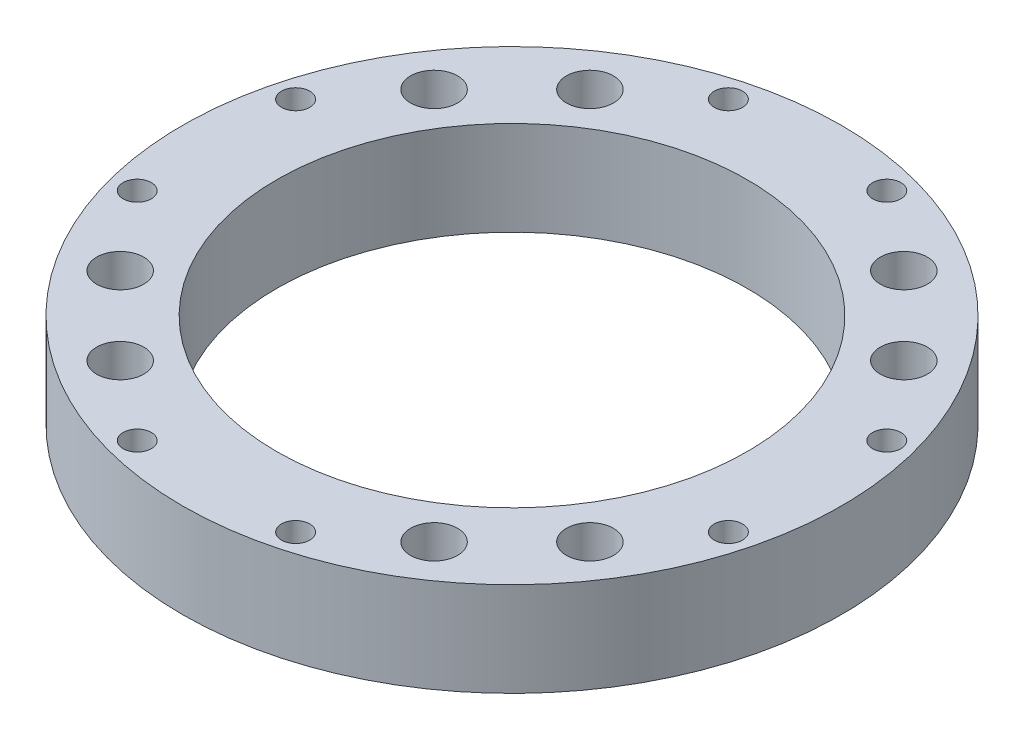
ISO-10303-21;
HEADER;
FILE_DESCRIPTION(('STEP AP214'),'2;1');
FILE_NAME('part.step','',(''),(''),'','','');
FILE_SCHEMA(('AUTOMOTIVE_DESIGN { 1 0 10303 214 1 1 1 1 }'));
ENDSEC;
DATA;
#1=APPLICATION_CONTEXT('core data for automotive mechanical design processes');
#2=APPLICATION_PROTOCOL_DEFINITION('international standard','automotive_design',2000,#1);
#3=PRODUCT_CONTEXT('',#1,'mechanical');
#4=PRODUCT('Part','Part','',(#3));
#5=PRODUCT_RELATED_PRODUCT_CATEGORY('part','',(#4));
#6=PRODUCT_DEFINITION_FORMATION('','',#4);
#7=PRODUCT_DEFINITION_CONTEXT('part definition',#1,'design');
#8=PRODUCT_DEFINITION('design','',#6,#7);
#9=PRODUCT_DEFINITION_SHAPE('','',#8);
#10=(LENGTH_UNIT() NAMED_UNIT(*) SI_UNIT(.MILLI.,.METRE.));
#11=(NAMED_UNIT(*) PLANE_ANGLE_UNIT() SI_UNIT($,.RADIAN.));
#12=(NAMED_UNIT(*) SI_UNIT($,.STERADIAN.) SOLID_ANGLE_UNIT());
#13=UNCERTAINTY_MEASURE_WITH_UNIT(LENGTH_MEASURE(1.E-05),#10,'distance_accuracy_value','');
#14=(GEOMETRIC_REPRESENTATION_CONTEXT(3) GLOBAL_UNCERTAINTY_ASSIGNED_CONTEXT((#13)) GLOBAL_UNIT_ASSIGNED_CONTEXT((#10,
#11,#12)) REPRESENTATION_CONTEXT('',''));
#15=CARTESIAN_POINT('',(0.,0.,0.));
#16=DIRECTION('',(0.,0.,1.));
#17=DIRECTION('',(1.,0.,0.));
#18=AXIS2_PLACEMENT_3D('',#15,#16,#17);
#19=CARTESIAN_POINT('',(0.,10.,0.));
#20=DIRECTION('',(0.,1.,0.));
#21=DIRECTION('',(0.,0.,1.));
#22=AXIS2_PLACEMENT_3D('',#19,#20,#21);
#23=PLANE('',#22);
#24=CARTESIAN_POINT('',(-16.6671069905869,10.,24.9440883690763));
#25=DIRECTION('',(0.,1.,0.));
#26=DIRECTION('',(0.,0.,1.));
#27=AXIS2_PLACEMENT_3D('',#24,#25,#26);
#28=CIRCLE('',#27,2.50000000000061);
#29=CARTESIAN_POINT('',(-16.6671069905869,10.,27.4440883690769));
#30=VERTEX_POINT('',#29);
#31=EDGE_CURVE('E133',#30,#30,#28,.T.);
#32=ORIENTED_EDGE('',*,*,#31,.F.);
#33=EDGE_LOOP('',(#32));
#34=FACE_BOUND('',#33,.T.);
#35=CARTESIAN_POINT('',(24.9440883690775,10.,16.6671069905869));
#36=DIRECTION('',(0.,1.,0.));
#37=DIRECTION('',(0.,0.,1.));
#38=AXIS2_PLACEMENT_3D('',#35,#36,#37);
#39=CIRCLE('',#38,2.50000000000167);
#40=CARTESIAN_POINT('',(24.9440883690775,10.,19.1671069905886));
#41=VERTEX_POINT('',#40);
#42=EDGE_CURVE('E121',#41,#41,#39,.T.);
#43=ORIENTED_EDGE('',*,*,#42,.F.);
#44=EDGE_LOOP('',(#43));
#45=FACE_BOUND('',#44,.T.);
#46=CARTESIAN_POINT('',(-31.3925893543937,10.,-8.41161896583101));
#47=DIRECTION('',(0.,1.,0.));
#48=DIRECTION('',(0.,0.,1.));
#49=AXIS2_PLACEMENT_3D('',#46,#47,#48);
#50=CIRCLE('',#49,1.50000000000116);
#51=CARTESIAN_POINT('',(-31.3925893543937,10.,-6.91161896582985));
#52=VERTEX_POINT('',#51);
#53=EDGE_CURVE('E109',#52,#52,#50,.T.);
#54=ORIENTED_EDGE('',*,*,#53,.F.);
#55=EDGE_LOOP('',(#54));
#56=FACE_BOUND('',#55,.T.);
#57=CARTESIAN_POINT('',(-16.6671069905888,10.,-24.9440883690771));
#58=DIRECTION('',(0.,1.,0.));
#59=DIRECTION('',(0.,0.,1.));
#60=AXIS2_PLACEMENT_3D('',#57,#58,#59);
#61=CIRCLE('',#60,2.5);
#62=CARTESIAN_POINT('',(-16.6671069905888,10.,-22.4440883690771));
#63=VERTEX_POINT('',#62);
#64=EDGE_CURVE('E97',#63,#63,#61,.T.);
#65=ORIENTED_EDGE('',*,*,#64,.F.);
#66=EDGE_LOOP('',(#65));
#67=FACE_BOUND('',#66,.T.);
#68=CARTESIAN_POINT('',(8.41161896583451,10.,31.3925893543941));
#69=DIRECTION('',(0.,1.,0.));
#70=DIRECTION('',(0.,0.,1.));
#71=AXIS2_PLACEMENT_3D('',#68,#69,#70);
#72=CIRCLE('',#71,1.50000000000299);
#73=CARTESIAN_POINT('',(8.41161896583451,10.,32.8925893543971));
#74=VERTEX_POINT('',#73);
#75=EDGE_CURVE('E85',#74,#74,#72,.T.);
#76=ORIENTED_EDGE('',*,*,#75,.F.);
#77=EDGE_LOOP('',(#76));
#78=FACE_BOUND('',#77,.T.);
#79=CARTESIAN_POINT('',(31.3925893543964,10.,8.41161896583034));
#80=DIRECTION('',(0.,1.,0.));
#81=DIRECTION('',(0.,0.,1.));
#82=AXIS2_PLACEMENT_3D('',#79,#80,#81);
#83=CIRCLE('',#82,1.50000000000218);
#84=CARTESIAN_POINT('',(31.3925893543964,10.,9.91161896583252));
#85=VERTEX_POINT('',#84);
#86=EDGE_CURVE('E73',#85,#85,#83,.T.);
#87=ORIENTED_EDGE('',*,*,#86,.F.);
#88=EDGE_LOOP('',(#87));
#89=FACE_BOUND('',#88,.T.);
#90=CARTESIAN_POINT('',(-24.9440883690763,10.,-16.6671069905881));
#91=DIRECTION('',(0.,1.,0.));
#92=DIRECTION('',(0.,0.,1.));
#93=AXIS2_PLACEMENT_3D('',#90,#91,#92);
#94=CIRCLE('',#93,2.5);
#95=CARTESIAN_POINT('',(-24.9440883690763,10.,-14.1671069905881));
#96=VERTEX_POINT('',#95);
#97=EDGE_CURVE('E61',#96,#96,#94,.T.);
#98=ORIENTED_EDGE('',*,*,#97,.F.);
#99=EDGE_LOOP('',(#98));
#100=FACE_BOUND('',#99,.T.);
#101=CARTESIAN_POINT('',(-8.41161896583183,10.,-31.3925893543947));
#102=DIRECTION('',(0.,1.,0.));
#103=DIRECTION('',(0.,0.,1.));
#104=AXIS2_PLACEMENT_3D('',#101,#102,#103);
#105=CIRCLE('',#104,1.5);
#106=CARTESIAN_POINT('',(-8.41161896583183,10.,-29.8925893543947));
#107=VERTEX_POINT('',#106);
#108=EDGE_CURVE('E49',#107,#107,#105,.T.);
#109=ORIENTED_EDGE('',*,*,#108,.F.);
#110=EDGE_LOOP('',(#109));
#111=FACE_BOUND('',#110,.T.);
#112=CARTESIAN_POINT('',(0.,10.,0.));
#113=DIRECTION('',(0.,1.,0.));
#114=DIRECTION('',(0.,0.,1.));
#115=AXIS2_PLACEMENT_3D('',#112,#113,#114);
#116=CIRCLE('',#115,35.);
#117=CARTESIAN_POINT('',(0.,10.,35.));
#118=VERTEX_POINT('',#117);
#119=EDGE_CURVE('E10',#118,#118,#116,.T.);
#120=ORIENTED_EDGE('',*,*,#119,.T.);
#121=EDGE_LOOP('',(#120));
#122=FACE_BOUND('',#121,.T.);
#123=CARTESIAN_POINT('',(0.,10.,0.));
#124=DIRECTION('',(0.,1.,0.));
#125=DIRECTION('',(0.,0.,1.));
#126=AXIS2_PLACEMENT_3D('',#123,#124,#125);
#127=CIRCLE('',#126,25.);
#128=CARTESIAN_POINT('',(0.,10.,25.));
#129=VERTEX_POINT('',#128);
#130=EDGE_CURVE('E44',#129,#129,#127,.T.);
#131=ORIENTED_EDGE('',*,*,#130,.F.);
#132=EDGE_LOOP('',(#131));
#133=FACE_BOUND('',#132,.T.);
#134=CARTESIAN_POINT('',(8.41161896583206,10.,-31.3925893543947));
#135=DIRECTION('',(0.,1.,0.));
#136=DIRECTION('',(0.,0.,1.));
#137=AXIS2_PLACEMENT_3D('',#134,#135,#136);
#138=CIRCLE('',#137,1.5);
#139=CARTESIAN_POINT('',(8.41161896583206,10.,-29.8925893543947));
#140=VERTEX_POINT('',#139);
#141=EDGE_CURVE('E55',#140,#140,#138,.T.);
#142=ORIENTED_EDGE('',*,*,#141,.F.);
#143=EDGE_LOOP('',(#142));
#144=FACE_BOUND('',#143,.T.);
#145=CARTESIAN_POINT('',(31.3925893543957,10.,-8.41161896583351));
#146=DIRECTION('',(0.,1.,0.));
#147=DIRECTION('',(0.,0.,1.));
#148=AXIS2_PLACEMENT_3D('',#145,#146,#147);
#149=CIRCLE('',#148,1.50000000000143);
#150=CARTESIAN_POINT('',(31.3925893543957,10.,-6.91161896583208));
#151=VERTEX_POINT('',#150);
#152=EDGE_CURVE('E67',#151,#151,#149,.T.);
#153=ORIENTED_EDGE('',*,*,#152,.F.);
#154=EDGE_LOOP('',(#153));
#155=FACE_BOUND('',#154,.T.);
#156=CARTESIAN_POINT('',(16.6671069905881,10.,-24.9440883690775));
#157=DIRECTION('',(0.,1.,0.));
#158=DIRECTION('',(0.,0.,1.));
#159=AXIS2_PLACEMENT_3D('',#156,#157,#158);
#160=CIRCLE('',#159,2.50000000000123);
#161=CARTESIAN_POINT('',(16.6671069905881,10.,-22.4440883690763));
#162=VERTEX_POINT('',#161);
#163=EDGE_CURVE('E79',#162,#162,#160,.T.);
#164=ORIENTED_EDGE('',*,*,#163,.F.);
#165=EDGE_LOOP('',(#164));
#166=FACE_BOUND('',#165,.T.);
#167=CARTESIAN_POINT('',(-8.41161896582934,10.,31.3925893543947));
#168=DIRECTION('',(0.,1.,0.));
#169=DIRECTION('',(0.,0.,1.));
#170=AXIS2_PLACEMENT_3D('',#167,#168,#169);
#171=CIRCLE('',#170,1.50000000000288);
#172=CARTESIAN_POINT('',(-8.41161896582934,10.,32.8925893543976));
#173=VERTEX_POINT('',#172);
#174=EDGE_CURVE('E91',#173,#173,#171,.T.);
#175=ORIENTED_EDGE('',*,*,#174,.F.);
#176=EDGE_LOOP('',(#175));
#177=FACE_BOUND('',#176,.T.);
#178=CARTESIAN_POINT('',(-31.3925893543931,10.,8.41161896583284));
#179=DIRECTION('',(0.,1.,0.));
#180=DIRECTION('',(0.,0.,1.));
#181=AXIS2_PLACEMENT_3D('',#178,#179,#180);
#182=CIRCLE('',#181,1.5000000000018);
#183=CARTESIAN_POINT('',(-31.3925893543931,10.,9.91161896583464));
#184=VERTEX_POINT('',#183);
#185=EDGE_CURVE('E103',#184,#184,#182,.T.);
#186=ORIENTED_EDGE('',*,*,#185,.F.);
#187=EDGE_LOOP('',(#186));
#188=FACE_BOUND('',#187,.T.);
#189=CARTESIAN_POINT('',(24.9440883690767,10.,-16.6671069905894));
#190=DIRECTION('',(0.,1.,0.));
#191=DIRECTION('',(0.,0.,1.));
#192=AXIS2_PLACEMENT_3D('',#189,#190,#191);
#193=CIRCLE('',#192,2.5000000000015);
#194=CARTESIAN_POINT('',(24.9440883690767,10.,-14.1671069905879));
#195=VERTEX_POINT('',#194);
#196=EDGE_CURVE('E115',#195,#195,#193,.T.);
#197=ORIENTED_EDGE('',*,*,#196,.F.);
#198=EDGE_LOOP('',(#197));
#199=FACE_BOUND('',#198,.T.);
#200=CARTESIAN_POINT('',(16.6671069905894,10.,24.9440883690755));
#201=DIRECTION('',(0.,1.,0.));
#202=DIRECTION('',(0.,0.,1.));
#203=AXIS2_PLACEMENT_3D('',#200,#201,#202);
#204=CIRCLE('',#203,2.50000000000148);
#205=CARTESIAN_POINT('',(16.6671069905894,10.,27.4440883690769));
#206=VERTEX_POINT('',#205);
#207=EDGE_CURVE('E127',#206,#206,#204,.T.);
#208=ORIENTED_EDGE('',*,*,#207,.F.);
#209=EDGE_LOOP('',(#208));
#210=FACE_BOUND('',#209,.T.);
#211=CARTESIAN_POINT('',(-24.9440883690755,10.,16.6671069905882));
#212=DIRECTION('',(0.,1.,0.));
#213=DIRECTION('',(0.,0.,1.));
#214=AXIS2_PLACEMENT_3D('',#211,#212,#213);
#215=CIRCLE('',#214,2.50000000000036);
#216=CARTESIAN_POINT('',(-24.9440883690755,10.,19.1671069905886));
#217=VERTEX_POINT('',#216);
#218=EDGE_CURVE('E139',#217,#217,#215,.T.);
#219=ORIENTED_EDGE('',*,*,#218,.F.);
#220=EDGE_LOOP('',(#219));
#221=FACE_BOUND('',#220,.T.);
#222=ADVANCED_FACE('F33',(#34,#45,#56,#67,#78,#89,#100,#111,#122,#133,#144,#155,#166,#177,#188,
#199,#210,#221),#23,.T.);
#223=CARTESIAN_POINT('',(0.,0.,0.));
#224=DIRECTION('',(0.,1.,0.));
#225=DIRECTION('',(0.,0.,1.));
#226=AXIS2_PLACEMENT_3D('',#223,#224,#225);
#227=PLANE('',#226);
#228=CARTESIAN_POINT('',(0.,0.,0.));
#229=DIRECTION('',(0.,1.,0.));
#230=DIRECTION('',(0.,0.,1.));
#231=AXIS2_PLACEMENT_3D('',#228,#229,#230);
#232=CIRCLE('',#231,35.);
#233=CARTESIAN_POINT('',(0.,0.,35.));
#234=VERTEX_POINT('',#233);
#235=EDGE_CURVE('E37',#234,#234,#232,.T.);
#236=ORIENTED_EDGE('',*,*,#235,.F.);
#237=EDGE_LOOP('',(#236));
#238=FACE_BOUND('',#237,.T.);
#239=CARTESIAN_POINT('',(0.,0.,0.));
#240=DIRECTION('',(0.,1.,0.));
#241=DIRECTION('',(0.,0.,1.));
#242=AXIS2_PLACEMENT_3D('',#239,#240,#241);
#243=CIRCLE('',#242,25.);
#244=CARTESIAN_POINT('',(0.,0.,25.));
#245=VERTEX_POINT('',#244);
#246=EDGE_CURVE('E46',#245,#245,#243,.T.);
#247=ORIENTED_EDGE('',*,*,#246,.T.);
#248=EDGE_LOOP('',(#247));
#249=FACE_BOUND('',#248,.T.);
#250=CARTESIAN_POINT('',(-8.41161896583183,0.,-31.3925893543947));
#251=DIRECTION('',(0.,1.,0.));
#252=DIRECTION('',(0.,0.,1.));
#253=AXIS2_PLACEMENT_3D('',#250,#251,#252);
#254=CIRCLE('',#253,1.5);
#255=CARTESIAN_POINT('',(-8.41161896583183,0.,-29.8925893543947));
#256=VERTEX_POINT('',#255);
#257=EDGE_CURVE('E52',#256,#256,#254,.T.);
#258=ORIENTED_EDGE('',*,*,#257,.T.);
#259=EDGE_LOOP('',(#258));
#260=FACE_BOUND('',#259,.T.);
#261=CARTESIAN_POINT('',(8.41161896583206,0.,-31.3925893543947));
#262=DIRECTION('',(0.,1.,0.));
#263=DIRECTION('',(0.,0.,1.));
#264=AXIS2_PLACEMENT_3D('',#261,#262,#263);
#265=CIRCLE('',#264,1.5);
#266=CARTESIAN_POINT('',(8.41161896583206,0.,-29.8925893543947));
#267=VERTEX_POINT('',#266);
#268=EDGE_CURVE('E58',#267,#267,#265,.T.);
#269=ORIENTED_EDGE('',*,*,#268,.T.);
#270=EDGE_LOOP('',(#269));
#271=FACE_BOUND('',#270,.T.);
#272=CARTESIAN_POINT('',(-24.9440883690763,0.,-16.6671069905881));
#273=DIRECTION('',(0.,1.,0.));
#274=DIRECTION('',(0.,0.,1.));
#275=AXIS2_PLACEMENT_3D('',#272,#273,#274);
#276=CIRCLE('',#275,2.5);
#277=CARTESIAN_POINT('',(-24.9440883690763,0.,-14.1671069905881));
#278=VERTEX_POINT('',#277);
#279=EDGE_CURVE('E64',#278,#278,#276,.T.);
#280=ORIENTED_EDGE('',*,*,#279,.T.);
#281=EDGE_LOOP('',(#280));
#282=FACE_BOUND('',#281,.T.);
#283=CARTESIAN_POINT('',(31.3925893543957,0.,-8.41161896583351));
#284=DIRECTION('',(0.,1.,0.));
#285=DIRECTION('',(0.,0.,1.));
#286=AXIS2_PLACEMENT_3D('',#283,#284,#285);
#287=CIRCLE('',#286,1.50000000000143);
#288=CARTESIAN_POINT('',(31.3925893543957,0.,-6.91161896583208));
#289=VERTEX_POINT('',#288);
#290=EDGE_CURVE('E70',#289,#289,#287,.T.);
#291=ORIENTED_EDGE('',*,*,#290,.T.);
#292=EDGE_LOOP('',(#291));
#293=FACE_BOUND('',#292,.T.);
#294=CARTESIAN_POINT('',(31.3925893543964,0.,8.41161896583034));
#295=DIRECTION('',(0.,1.,0.));
#296=DIRECTION('',(0.,0.,1.));
#297=AXIS2_PLACEMENT_3D('',#294,#295,#296);
#298=CIRCLE('',#297,1.50000000000218);
#299=CARTESIAN_POINT('',(31.3925893543964,0.,9.91161896583252));
#300=VERTEX_POINT('',#299);
#301=EDGE_CURVE('E76',#300,#300,#298,.T.);
#302=ORIENTED_EDGE('',*,*,#301,.T.);
#303=EDGE_LOOP('',(#302));
#304=FACE_BOUND('',#303,.T.);
#305=CARTESIAN_POINT('',(16.6671069905881,0.,-24.9440883690775));
#306=DIRECTION('',(0.,1.,0.));
#307=DIRECTION('',(0.,0.,1.));
#308=AXIS2_PLACEMENT_3D('',#305,#306,#307);
#309=CIRCLE('',#308,2.50000000000123);
#310=CARTESIAN_POINT('',(16.6671069905881,0.,-22.4440883690763));
#311=VERTEX_POINT('',#310);
#312=EDGE_CURVE('E82',#311,#311,#309,.T.);
#313=ORIENTED_EDGE('',*,*,#312,.T.);
#314=EDGE_LOOP('',(#313));
#315=FACE_BOUND('',#314,.T.);
#316=CARTESIAN_POINT('',(8.41161896583451,0.,31.3925893543941));
#317=DIRECTION('',(0.,1.,0.));
#318=DIRECTION('',(0.,0.,1.));
#319=AXIS2_PLACEMENT_3D('',#316,#317,#318);
#320=CIRCLE('',#319,1.50000000000299);
#321=CARTESIAN_POINT('',(8.41161896583451,0.,32.8925893543971));
#322=VERTEX_POINT('',#321);
#323=EDGE_CURVE('E88',#322,#322,#320,.T.);
#324=ORIENTED_EDGE('',*,*,#323,.T.);
#325=EDGE_LOOP('',(#324));
#326=FACE_BOUND('',#325,.T.);
#327=CARTESIAN_POINT('',(-8.41161896582934,0.,31.3925893543947));
#328=DIRECTION('',(0.,1.,0.));
#329=DIRECTION('',(0.,0.,1.));
#330=AXIS2_PLACEMENT_3D('',#327,#328,#329);
#331=CIRCLE('',#330,1.50000000000288);
#332=CARTESIAN_POINT('',(-8.41161896582934,0.,32.8925893543976));
#333=VERTEX_POINT('',#332);
#334=EDGE_CURVE('E94',#333,#333,#331,.T.);
#335=ORIENTED_EDGE('',*,*,#334,.T.);
#336=EDGE_LOOP('',(#335));
#337=FACE_BOUND('',#336,.T.);
#338=CARTESIAN_POINT('',(-16.6671069905888,0.,-24.9440883690771));
#339=DIRECTION('',(0.,1.,0.));
#340=DIRECTION('',(0.,0.,1.));
#341=AXIS2_PLACEMENT_3D('',#338,#339,#340);
#342=CIRCLE('',#341,2.5);
#343=CARTESIAN_POINT('',(-16.6671069905888,0.,-22.4440883690771));
#344=VERTEX_POINT('',#343);
#345=EDGE_CURVE('E100',#344,#344,#342,.T.);
#346=ORIENTED_EDGE('',*,*,#345,.T.);
#347=EDGE_LOOP('',(#346));
#348=FACE_BOUND('',#347,.T.);
#349=CARTESIAN_POINT('',(-31.3925893543931,0.,8.41161896583284));
#350=DIRECTION('',(0.,1.,0.));
#351=DIRECTION('',(0.,0.,1.));
#352=AXIS2_PLACEMENT_3D('',#349,#350,#351);
#353=CIRCLE('',#352,1.5000000000018);
#354=CARTESIAN_POINT('',(-31.3925893543931,0.,9.91161896583464));
#355=VERTEX_POINT('',#354);
#356=EDGE_CURVE('E106',#355,#355,#353,.T.);
#357=ORIENTED_EDGE('',*,*,#356,.T.);
#358=EDGE_LOOP('',(#357));
#359=FACE_BOUND('',#358,.T.);
#360=CARTESIAN_POINT('',(-31.3925893543937,0.,-8.41161896583101));
#361=DIRECTION('',(0.,1.,0.));
#362=DIRECTION('',(0.,0.,1.));
#363=AXIS2_PLACEMENT_3D('',#360,#361,#362);
#364=CIRCLE('',#363,1.50000000000116);
#365=CARTESIAN_POINT('',(-31.3925893543937,0.,-6.91161896582985));
#366=VERTEX_POINT('',#365);
#367=EDGE_CURVE('E112',#366,#366,#364,.T.);
#368=ORIENTED_EDGE('',*,*,#367,.T.);
#369=EDGE_LOOP('',(#368));
#370=FACE_BOUND('',#369,.T.);
#371=CARTESIAN_POINT('',(24.9440883690767,0.,-16.6671069905894));
#372=DIRECTION('',(0.,1.,0.));
#373=DIRECTION('',(0.,0.,1.));
#374=AXIS2_PLACEMENT_3D('',#371,#372,#373);
#375=CIRCLE('',#374,2.5000000000015);
#376=CARTESIAN_POINT('',(24.9440883690767,0.,-14.1671069905879));
#377=VERTEX_POINT('',#376);
#378=EDGE_CURVE('E118',#377,#377,#375,.T.);
#379=ORIENTED_EDGE('',*,*,#378,.T.);
#380=EDGE_LOOP('',(#379));
#381=FACE_BOUND('',#380,.T.);
#382=CARTESIAN_POINT('',(24.9440883690775,0.,16.6671069905869));
#383=DIRECTION('',(0.,1.,0.));
#384=DIRECTION('',(0.,0.,1.));
#385=AXIS2_PLACEMENT_3D('',#382,#383,#384);
#386=CIRCLE('',#385,2.50000000000167);
#387=CARTESIAN_POINT('',(24.9440883690775,0.,19.1671069905886));
#388=VERTEX_POINT('',#387);
#389=EDGE_CURVE('E124',#388,#388,#386,.T.);
#390=ORIENTED_EDGE('',*,*,#389,.T.);
#391=EDGE_LOOP('',(#390));
#392=FACE_BOUND('',#391,.T.);
#393=CARTESIAN_POINT('',(16.6671069905894,0.,24.9440883690755));
#394=DIRECTION('',(0.,1.,0.));
#395=DIRECTION('',(0.,0.,1.));
#396=AXIS2_PLACEMENT_3D('',#393,#394,#395);
#397=CIRCLE('',#396,2.50000000000148);
#398=CARTESIAN_POINT('',(16.6671069905894,0.,27.4440883690769));
#399=VERTEX_POINT('',#398);
#400=EDGE_CURVE('E130',#399,#399,#397,.T.);
#401=ORIENTED_EDGE('',*,*,#400,.T.);
#402=EDGE_LOOP('',(#401));
#403=FACE_BOUND('',#402,.T.);
#404=CARTESIAN_POINT('',(-16.6671069905869,0.,24.9440883690763));
#405=DIRECTION('',(0.,1.,0.));
#406=DIRECTION('',(0.,0.,1.));
#407=AXIS2_PLACEMENT_3D('',#404,#405,#406);
#408=CIRCLE('',#407,2.50000000000061);
#409=CARTESIAN_POINT('',(-16.6671069905869,0.,27.4440883690769));
#410=VERTEX_POINT('',#409);
#411=EDGE_CURVE('E136',#410,#410,#408,.T.);
#412=ORIENTED_EDGE('',*,*,#411,.T.);
#413=EDGE_LOOP('',(#412));
#414=FACE_BOUND('',#413,.T.);
#415=CARTESIAN_POINT('',(-24.9440883690755,0.,16.6671069905882));
#416=DIRECTION('',(0.,1.,0.));
#417=DIRECTION('',(0.,0.,1.));
#418=AXIS2_PLACEMENT_3D('',#415,#416,#417);
#419=CIRCLE('',#418,2.50000000000036);
#420=CARTESIAN_POINT('',(-24.9440883690755,0.,19.1671069905886));
#421=VERTEX_POINT('',#420);
#422=EDGE_CURVE('E142',#421,#421,#419,.T.);
#423=ORIENTED_EDGE('',*,*,#422,.T.);
#424=EDGE_LOOP('',(#423));
#425=FACE_BOUND('',#424,.T.);
#426=ADVANCED_FACE('F152',(#238,#249,#260,#271,#282,#293,#304,#315,#326,#337,#348,#359,#370,
#381,#392,#403,#414,#425),#227,.F.);
#427=CARTESIAN_POINT('',(0.,10.,0.));
#428=DIRECTION('',(0.,-1.,0.));
#429=DIRECTION('',(0.,0.,-1.));
#430=AXIS2_PLACEMENT_3D('',#427,#428,#429);
#431=CYLINDRICAL_SURFACE('',#430,35.);
#432=ORIENTED_EDGE('',*,*,#119,.F.);
#433=EDGE_LOOP('',(#432));
#434=FACE_BOUND('',#433,.T.);
#435=ORIENTED_EDGE('',*,*,#235,.T.);
#436=EDGE_LOOP('',(#435));
#437=FACE_BOUND('',#436,.T.);
#438=ADVANCED_FACE('F35',(#434,#437),#431,.T.);
#439=CARTESIAN_POINT('',(0.,10.,0.));
#440=DIRECTION('',(0.,-1.,0.));
#441=DIRECTION('',(0.,0.,-1.));
#442=AXIS2_PLACEMENT_3D('',#439,#440,#441);
#443=CYLINDRICAL_SURFACE('',#442,25.);
#444=ORIENTED_EDGE('',*,*,#130,.T.);
#445=EDGE_LOOP('',(#444));
#446=FACE_BOUND('',#445,.T.);
#447=ORIENTED_EDGE('',*,*,#246,.F.);
#448=EDGE_LOOP('',(#447));
#449=FACE_BOUND('',#448,.T.);
#450=ADVANCED_FACE('F162',(#446,#449),#443,.F.);
#451=CARTESIAN_POINT('',(-8.41161896583183,10.,-31.3925893543947));
#452=DIRECTION('',(0.,-1.,0.));
#453=DIRECTION('',(0.,0.,-1.));
#454=AXIS2_PLACEMENT_3D('',#451,#452,#453);
#455=CYLINDRICAL_SURFACE('',#454,1.5);
#456=ORIENTED_EDGE('',*,*,#108,.T.);
#457=EDGE_LOOP('',(#456));
#458=FACE_BOUND('',#457,.T.);
#459=ORIENTED_EDGE('',*,*,#257,.F.);
#460=EDGE_LOOP('',(#459));
#461=FACE_BOUND('',#460,.T.);
#462=ADVANCED_FACE('F165',(#458,#461),#455,.F.);
#463=CARTESIAN_POINT('',(8.41161896583206,10.,-31.3925893543947));
#464=DIRECTION('',(0.,-1.,0.));
#465=DIRECTION('',(0.,0.,-1.));
#466=AXIS2_PLACEMENT_3D('',#463,#464,#465);
#467=CYLINDRICAL_SURFACE('',#466,1.5);
#468=ORIENTED_EDGE('',*,*,#141,.T.);
#469=EDGE_LOOP('',(#468));
#470=FACE_BOUND('',#469,.T.);
#471=ORIENTED_EDGE('',*,*,#268,.F.);
#472=EDGE_LOOP('',(#471));
#473=FACE_BOUND('',#472,.T.);
#474=ADVANCED_FACE('F169',(#470,#473),#467,.F.);
#475=CARTESIAN_POINT('',(-24.9440883690763,10.,-16.6671069905881));
#476=DIRECTION('',(0.,-1.,0.));
#477=DIRECTION('',(0.,0.,-1.));
#478=AXIS2_PLACEMENT_3D('',#475,#476,#477);
#479=CYLINDRICAL_SURFACE('',#478,2.5);
#480=ORIENTED_EDGE('',*,*,#97,.T.);
#481=EDGE_LOOP('',(#480));
#482=FACE_BOUND('',#481,.T.);
#483=ORIENTED_EDGE('',*,*,#279,.F.);
#484=EDGE_LOOP('',(#483));
#485=FACE_BOUND('',#484,.T.);
#486=ADVANCED_FACE('F173',(#482,#485),#479,.F.);
#487=CARTESIAN_POINT('',(31.3925893543957,10.,-8.41161896583351));
#488=DIRECTION('',(0.,-1.,0.));
#489=DIRECTION('',(0.,0.,-1.));
#490=AXIS2_PLACEMENT_3D('',#487,#488,#489);
#491=CYLINDRICAL_SURFACE('',#490,1.50000000000143);
#492=ORIENTED_EDGE('',*,*,#152,.T.);
#493=EDGE_LOOP('',(#492));
#494=FACE_BOUND('',#493,.T.);
#495=ORIENTED_EDGE('',*,*,#290,.F.);
#496=EDGE_LOOP('',(#495));
#497=FACE_BOUND('',#496,.T.);
#498=ADVANCED_FACE('F177',(#494,#497),#491,.F.);
#499=CARTESIAN_POINT('',(31.3925893543964,10.,8.41161896583034));
#500=DIRECTION('',(0.,-1.,0.));
#501=DIRECTION('',(0.,0.,-1.));
#502=AXIS2_PLACEMENT_3D('',#499,#500,#501);
#503=CYLINDRICAL_SURFACE('',#502,1.50000000000218);
#504=ORIENTED_EDGE('',*,*,#86,.T.);
#505=EDGE_LOOP('',(#504));
#506=FACE_BOUND('',#505,.T.);
#507=ORIENTED_EDGE('',*,*,#301,.F.);
#508=EDGE_LOOP('',(#507));
#509=FACE_BOUND('',#508,.T.);
#510=ADVANCED_FACE('F181',(#506,#509),#503,.F.);
#511=CARTESIAN_POINT('',(16.6671069905881,10.,-24.9440883690775));
#512=DIRECTION('',(0.,-1.,0.));
#513=DIRECTION('',(0.,0.,-1.));
#514=AXIS2_PLACEMENT_3D('',#511,#512,#513);
#515=CYLINDRICAL_SURFACE('',#514,2.50000000000123);
#516=ORIENTED_EDGE('',*,*,#163,.T.);
#517=EDGE_LOOP('',(#516));
#518=FACE_BOUND('',#517,.T.);
#519=ORIENTED_EDGE('',*,*,#312,.F.);
#520=EDGE_LOOP('',(#519));
#521=FACE_BOUND('',#520,.T.);
#522=ADVANCED_FACE('F185',(#518,#521),#515,.F.);
#523=CARTESIAN_POINT('',(8.41161896583451,10.,31.3925893543941));
#524=DIRECTION('',(0.,-1.,0.));
#525=DIRECTION('',(0.,0.,-1.));
#526=AXIS2_PLACEMENT_3D('',#523,#524,#525);
#527=CYLINDRICAL_SURFACE('',#526,1.50000000000299);
#528=ORIENTED_EDGE('',*,*,#75,.T.);
#529=EDGE_LOOP('',(#528));
#530=FACE_BOUND('',#529,.T.);
#531=ORIENTED_EDGE('',*,*,#323,.F.);
#532=EDGE_LOOP('',(#531));
#533=FACE_BOUND('',#532,.T.);
#534=ADVANCED_FACE('F189',(#530,#533),#527,.F.);
#535=CARTESIAN_POINT('',(-8.41161896582934,10.,31.3925893543947));
#536=DIRECTION('',(0.,-1.,0.));
#537=DIRECTION('',(0.,0.,-1.));
#538=AXIS2_PLACEMENT_3D('',#535,#536,#537);
#539=CYLINDRICAL_SURFACE('',#538,1.50000000000288);
#540=ORIENTED_EDGE('',*,*,#174,.T.);
#541=EDGE_LOOP('',(#540));
#542=FACE_BOUND('',#541,.T.);
#543=ORIENTED_EDGE('',*,*,#334,.F.);
#544=EDGE_LOOP('',(#543));
#545=FACE_BOUND('',#544,.T.);
#546=ADVANCED_FACE('F193',(#542,#545),#539,.F.);
#547=CARTESIAN_POINT('',(-16.6671069905888,10.,-24.9440883690771));
#548=DIRECTION('',(0.,-1.,0.));
#549=DIRECTION('',(0.,0.,-1.));
#550=AXIS2_PLACEMENT_3D('',#547,#548,#549);
#551=CYLINDRICAL_SURFACE('',#550,2.5);
#552=ORIENTED_EDGE('',*,*,#64,.T.);
#553=EDGE_LOOP('',(#552));
#554=FACE_BOUND('',#553,.T.);
#555=ORIENTED_EDGE('',*,*,#345,.F.);
#556=EDGE_LOOP('',(#555));
#557=FACE_BOUND('',#556,.T.);
#558=ADVANCED_FACE('F197',(#554,#557),#551,.F.);
#559=CARTESIAN_POINT('',(-31.3925893543931,10.,8.41161896583284));
#560=DIRECTION('',(0.,-1.,0.));
#561=DIRECTION('',(0.,0.,-1.));
#562=AXIS2_PLACEMENT_3D('',#559,#560,#561);
#563=CYLINDRICAL_SURFACE('',#562,1.5000000000018);
#564=ORIENTED_EDGE('',*,*,#185,.T.);
#565=EDGE_LOOP('',(#564));
#566=FACE_BOUND('',#565,.T.);
#567=ORIENTED_EDGE('',*,*,#356,.F.);
#568=EDGE_LOOP('',(#567));
#569=FACE_BOUND('',#568,.T.);
#570=ADVANCED_FACE('F201',(#566,#569),#563,.F.);
#571=CARTESIAN_POINT('',(-31.3925893543937,10.,-8.41161896583101));
#572=DIRECTION('',(0.,-1.,0.));
#573=DIRECTION('',(0.,0.,-1.));
#574=AXIS2_PLACEMENT_3D('',#571,#572,#573);
#575=CYLINDRICAL_SURFACE('',#574,1.50000000000116);
#576=ORIENTED_EDGE('',*,*,#53,.T.);
#577=EDGE_LOOP('',(#576));
#578=FACE_BOUND('',#577,.T.);
#579=ORIENTED_EDGE('',*,*,#367,.F.);
#580=EDGE_LOOP('',(#579));
#581=FACE_BOUND('',#580,.T.);
#582=ADVANCED_FACE('F205',(#578,#581),#575,.F.);
#583=CARTESIAN_POINT('',(24.9440883690767,10.,-16.6671069905894));
#584=DIRECTION('',(0.,-1.,0.));
#585=DIRECTION('',(0.,0.,-1.));
#586=AXIS2_PLACEMENT_3D('',#583,#584,#585);
#587=CYLINDRICAL_SURFACE('',#586,2.5000000000015);
#588=ORIENTED_EDGE('',*,*,#196,.T.);
#589=EDGE_LOOP('',(#588));
#590=FACE_BOUND('',#589,.T.);
#591=ORIENTED_EDGE('',*,*,#378,.F.);
#592=EDGE_LOOP('',(#591));
#593=FACE_BOUND('',#592,.T.);
#594=ADVANCED_FACE('F209',(#590,#593),#587,.F.);
#595=CARTESIAN_POINT('',(24.9440883690775,10.,16.6671069905869));
#596=DIRECTION('',(0.,-1.,0.));
#597=DIRECTION('',(0.,0.,-1.));
#598=AXIS2_PLACEMENT_3D('',#595,#596,#597);
#599=CYLINDRICAL_SURFACE('',#598,2.50000000000167);
#600=ORIENTED_EDGE('',*,*,#42,.T.);
#601=EDGE_LOOP('',(#600));
#602=FACE_BOUND('',#601,.T.);
#603=ORIENTED_EDGE('',*,*,#389,.F.);
#604=EDGE_LOOP('',(#603));
#605=FACE_BOUND('',#604,.T.);
#606=ADVANCED_FACE('F213',(#602,#605),#599,.F.);
#607=CARTESIAN_POINT('',(16.6671069905894,10.,24.9440883690755));
#608=DIRECTION('',(0.,-1.,0.));
#609=DIRECTION('',(0.,0.,-1.));
#610=AXIS2_PLACEMENT_3D('',#607,#608,#609);
#611=CYLINDRICAL_SURFACE('',#610,2.50000000000148);
#612=ORIENTED_EDGE('',*,*,#207,.T.);
#613=EDGE_LOOP('',(#612));
#614=FACE_BOUND('',#613,.T.);
#615=ORIENTED_EDGE('',*,*,#400,.F.);
#616=EDGE_LOOP('',(#615));
#617=FACE_BOUND('',#616,.T.);
#618=ADVANCED_FACE('F217',(#614,#617),#611,.F.);
#619=CARTESIAN_POINT('',(-16.6671069905869,10.,24.9440883690763));
#620=DIRECTION('',(0.,-1.,0.));
#621=DIRECTION('',(0.,0.,-1.));
#622=AXIS2_PLACEMENT_3D('',#619,#620,#621);
#623=CYLINDRICAL_SURFACE('',#622,2.50000000000061);
#624=ORIENTED_EDGE('',*,*,#31,.T.);
#625=EDGE_LOOP('',(#624));
#626=FACE_BOUND('',#625,.T.);
#627=ORIENTED_EDGE('',*,*,#411,.F.);
#628=EDGE_LOOP('',(#627));
#629=FACE_BOUND('',#628,.T.);
#630=ADVANCED_FACE('F221',(#626,#629),#623,.F.);
#631=CARTESIAN_POINT('',(-24.9440883690755,10.,16.6671069905882));
#632=DIRECTION('',(0.,-1.,0.));
#633=DIRECTION('',(0.,0.,-1.));
#634=AXIS2_PLACEMENT_3D('',#631,#632,#633);
#635=CYLINDRICAL_SURFACE('',#634,2.50000000000036);
#636=ORIENTED_EDGE('',*,*,#218,.T.);
#637=EDGE_LOOP('',(#636));
#638=FACE_BOUND('',#637,.T.);
#639=ORIENTED_EDGE('',*,*,#422,.F.);
#640=EDGE_LOOP('',(#639));
#641=FACE_BOUND('',#640,.T.);
#642=ADVANCED_FACE('F148',(#638,#641),#635,.F.);
#643=CLOSED_SHELL('',(#222,#426,#438,#450,#462,#474,#486,#498,#510,#522,#534,#546,#558,#570,
#582,#594,#606,#618,#630,#642));
#644=MANIFOLD_SOLID_BREP('B2',#643);
#645=ADVANCED_BREP_SHAPE_REPRESENTATION('',(#18,#644),#14);
#646=SHAPE_DEFINITION_REPRESENTATION(#9,#645);
ENDSEC;
END-ISO-10303-21;
